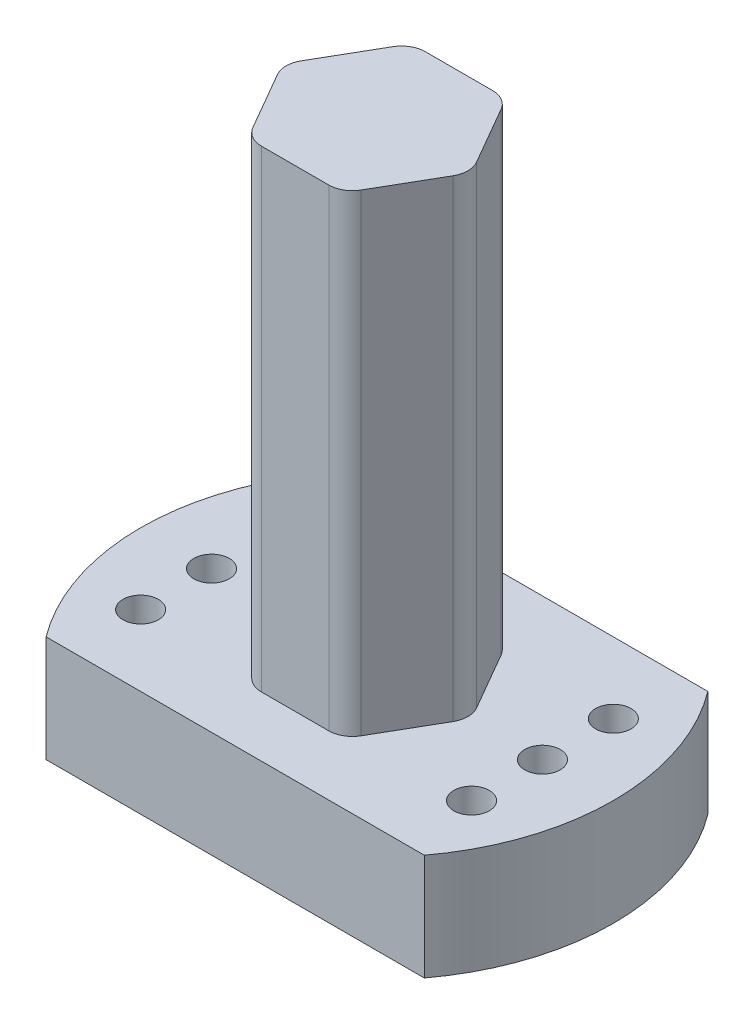
ISO-10303-21;
HEADER;
FILE_DESCRIPTION(('STEP AP214'),'2;1');
FILE_NAME('part.step','',(''),(''),'','','');
FILE_SCHEMA(('AUTOMOTIVE_DESIGN { 1 0 10303 214 1 1 1 1 }'));
ENDSEC;
DATA;
#1=APPLICATION_CONTEXT('core data for automotive mechanical design processes');
#2=APPLICATION_PROTOCOL_DEFINITION('international standard','automotive_design',2000,#1);
#3=PRODUCT_CONTEXT('',#1,'mechanical');
#4=PRODUCT('Part','Part','',(#3));
#5=PRODUCT_RELATED_PRODUCT_CATEGORY('part','',(#4));
#6=PRODUCT_DEFINITION_FORMATION('','',#4);
#7=PRODUCT_DEFINITION_CONTEXT('part definition',#1,'design');
#8=PRODUCT_DEFINITION('design','',#6,#7);
#9=PRODUCT_DEFINITION_SHAPE('','',#8);
#10=(LENGTH_UNIT() NAMED_UNIT(*) SI_UNIT(.MILLI.,.METRE.));
#11=(NAMED_UNIT(*) PLANE_ANGLE_UNIT() SI_UNIT($,.RADIAN.));
#12=(NAMED_UNIT(*) SI_UNIT($,.STERADIAN.) SOLID_ANGLE_UNIT());
#13=UNCERTAINTY_MEASURE_WITH_UNIT(LENGTH_MEASURE(1.E-05),#10,'distance_accuracy_value','');
#14=(GEOMETRIC_REPRESENTATION_CONTEXT(3) GLOBAL_UNCERTAINTY_ASSIGNED_CONTEXT((#13)) GLOBAL_UNIT_ASSIGNED_CONTEXT((#10,
#11,#12)) REPRESENTATION_CONTEXT('',''));
#15=CARTESIAN_POINT('',(0.,0.,0.));
#16=DIRECTION('',(0.,0.,1.));
#17=DIRECTION('',(1.,0.,0.));
#18=AXIS2_PLACEMENT_3D('',#15,#16,#17);
#19=CARTESIAN_POINT('',(0.,4.5,0.));
#20=DIRECTION('',(0.,1.,0.));
#21=DIRECTION('',(0.,0.,1.));
#22=AXIS2_PLACEMENT_3D('',#19,#20,#21);
#23=PLANE('',#22);
#24=CARTESIAN_POINT('',(6.99999999999998,4.5,-3.));
#25=DIRECTION('',(0.,1.,0.));
#26=DIRECTION('',(0.,0.,-1.));
#27=AXIS2_PLACEMENT_3D('',#24,#25,#26);
#28=CIRCLE('',#27,0.750000000000001);
#29=CARTESIAN_POINT('',(6.99999999999998,4.5,-3.75));
#30=VERTEX_POINT('',#29);
#31=EDGE_CURVE('E337',#30,#30,#28,.T.);
#32=ORIENTED_EDGE('',*,*,#31,.F.);
#33=EDGE_LOOP('',(#32));
#34=FACE_BOUND('',#33,.T.);
#35=CARTESIAN_POINT('',(7.,4.5,3.));
#36=DIRECTION('',(0.,1.,0.));
#37=DIRECTION('',(0.,0.,-1.));
#38=AXIS2_PLACEMENT_3D('',#35,#36,#37);
#39=CIRCLE('',#38,0.750000000000001);
#40=CARTESIAN_POINT('',(7.,4.5,2.25));
#41=VERTEX_POINT('',#40);
#42=EDGE_CURVE('E353',#41,#41,#39,.T.);
#43=ORIENTED_EDGE('',*,*,#42,.F.);
#44=EDGE_LOOP('',(#43));
#45=FACE_BOUND('',#44,.T.);
#46=CARTESIAN_POINT('',(-6.99999999999999,4.5,0.));
#47=DIRECTION('',(0.,1.,0.));
#48=DIRECTION('',(0.,0.,1.));
#49=AXIS2_PLACEMENT_3D('',#46,#47,#48);
#50=CIRCLE('',#49,0.749999999999999);
#51=CARTESIAN_POINT('',(-6.99999999999999,4.5,0.750000000000001));
#52=VERTEX_POINT('',#51);
#53=EDGE_CURVE('E369',#52,#52,#50,.T.);
#54=ORIENTED_EDGE('',*,*,#53,.F.);
#55=EDGE_LOOP('',(#54));
#56=FACE_BOUND('',#55,.T.);
#57=CARTESIAN_POINT('',(0.,4.5,0.));
#58=DIRECTION('',(0.,1.,0.));
#59=DIRECTION('',(0.,0.,1.));
#60=AXIS2_PLACEMENT_3D('',#57,#58,#59);
#61=CIRCLE('',#60,10.);
#62=CARTESIAN_POINT('',(-8.,4.5,-6.));
#63=VERTEX_POINT('',#62);
#64=CARTESIAN_POINT('',(-8.,4.5,6.));
#65=VERTEX_POINT('',#64);
#66=EDGE_CURVE('E169',#63,#65,#61,.T.);
#67=ORIENTED_EDGE('',*,*,#66,.T.);
#68=DIRECTION('',(1.,0.,0.));
#69=VECTOR('',#68,1.);
#70=CARTESIAN_POINT('',(8.,4.5,6.));
#71=LINE('',#70,#69);
#72=CARTESIAN_POINT('',(8.,4.5,6.));
#73=VERTEX_POINT('',#72);
#74=EDGE_CURVE('E157',#65,#73,#71,.T.);
#75=ORIENTED_EDGE('',*,*,#74,.T.);
#76=CARTESIAN_POINT('',(0.,4.5,0.));
#77=DIRECTION('',(0.,1.,0.));
#78=DIRECTION('',(0.,0.,1.));
#79=AXIS2_PLACEMENT_3D('',#76,#77,#78);
#80=CIRCLE('',#79,10.);
#81=CARTESIAN_POINT('',(8.,4.5,-6.));
#82=VERTEX_POINT('',#81);
#83=EDGE_CURVE('E168',#73,#82,#80,.T.);
#84=ORIENTED_EDGE('',*,*,#83,.T.);
#85=DIRECTION('',(-1.,0.,0.));
#86=VECTOR('',#85,1.);
#87=CARTESIAN_POINT('',(-8.,4.5,-6.));
#88=LINE('',#87,#86);
#89=EDGE_CURVE('E174',#82,#63,#88,.T.);
#90=ORIENTED_EDGE('',*,*,#89,.T.);
#91=EDGE_LOOP('',(#67,#75,#84,#90));
#92=FACE_BOUND('',#91,.T.);
#93=CARTESIAN_POINT('',(-6.99999999999998,4.5,3.));
#94=DIRECTION('',(0.,1.,0.));
#95=DIRECTION('',(0.,0.,1.));
#96=AXIS2_PLACEMENT_3D('',#93,#94,#95);
#97=CIRCLE('',#96,0.749999999999999);
#98=CARTESIAN_POINT('',(-6.99999999999998,4.5,3.75));
#99=VERTEX_POINT('',#98);
#100=EDGE_CURVE('E361',#99,#99,#97,.T.);
#101=ORIENTED_EDGE('',*,*,#100,.F.);
#102=EDGE_LOOP('',(#101));
#103=FACE_BOUND('',#102,.T.);
#104=CARTESIAN_POINT('',(6.99999999999999,4.5,0.));
#105=DIRECTION('',(0.,1.,0.));
#106=DIRECTION('',(0.,0.,-1.));
#107=AXIS2_PLACEMENT_3D('',#104,#105,#106);
#108=CIRCLE('',#107,0.750000000000001);
#109=CARTESIAN_POINT('',(6.99999999999999,4.5,-0.75));
#110=VERTEX_POINT('',#109);
#111=EDGE_CURVE('E345',#110,#110,#108,.T.);
#112=ORIENTED_EDGE('',*,*,#111,.F.);
#113=EDGE_LOOP('',(#112));
#114=FACE_BOUND('',#113,.T.);
#115=CARTESIAN_POINT('',(-7.,4.5,-3.));
#116=DIRECTION('',(0.,1.,0.));
#117=DIRECTION('',(0.,0.,1.));
#118=AXIS2_PLACEMENT_3D('',#115,#116,#117);
#119=CIRCLE('',#118,0.749999999999999);
#120=CARTESIAN_POINT('',(-7.,4.5,-2.25));
#121=VERTEX_POINT('',#120);
#122=EDGE_CURVE('E329',#121,#121,#119,.T.);
#123=ORIENTED_EDGE('',*,*,#122,.F.);
#124=EDGE_LOOP('',(#123));
#125=FACE_BOUND('',#124,.T.);
#126=DIRECTION('',(-1.,0.,0.));
#127=VECTOR('',#126,1.);
#128=CARTESIAN_POINT('',(2.,4.5,-3.46410161513776));
#129=LINE('',#128,#127);
#130=CARTESIAN_POINT('',(1.42264973081037,4.5,-3.46410161513776));
#131=VERTEX_POINT('',#130);
#132=CARTESIAN_POINT('',(-1.42264973081037,4.5,-3.46410161513775));
#133=VERTEX_POINT('',#132);
#134=EDGE_CURVE('E315',#131,#133,#129,.T.);
#135=ORIENTED_EDGE('',*,*,#134,.F.);
#136=CARTESIAN_POINT('',(1.42264973081037,4.5,-2.46410161513776));
#137=DIRECTION('',(0.,1.,0.));
#138=DIRECTION('',(0.,0.,1.));
#139=AXIS2_PLACEMENT_3D('',#136,#137,#138);
#140=CIRCLE('',#139,1.);
#141=CARTESIAN_POINT('',(2.28867513459481,4.5,-2.96410161513776));
#142=VERTEX_POINT('',#141);
#143=EDGE_CURVE('E256',#131,#142,#140,.F.);
#144=ORIENTED_EDGE('',*,*,#143,.T.);
#145=DIRECTION('',(-0.5,0.,-0.866025403784439));
#146=VECTOR('',#145,1.);
#147=CARTESIAN_POINT('',(4.,4.5,0.));
#148=LINE('',#147,#146);
#149=CARTESIAN_POINT('',(3.71132486540519,4.5,-0.500000000000001));
#150=VERTEX_POINT('',#149);
#151=EDGE_CURVE('E267',#150,#142,#148,.T.);
#152=ORIENTED_EDGE('',*,*,#151,.F.);
#153=CARTESIAN_POINT('',(2.84529946162075,4.5,0.));
#154=DIRECTION('',(0.,1.,0.));
#155=DIRECTION('',(0.,0.,1.));
#156=AXIS2_PLACEMENT_3D('',#153,#154,#155);
#157=CIRCLE('',#156,1.);
#158=CARTESIAN_POINT('',(3.71132486540519,4.5,0.499999999999999));
#159=VERTEX_POINT('',#158);
#160=EDGE_CURVE('E259',#150,#159,#157,.F.);
#161=ORIENTED_EDGE('',*,*,#160,.T.);
#162=DIRECTION('',(0.5,0.,-0.866025403784439));
#163=VECTOR('',#162,1.);
#164=CARTESIAN_POINT('',(2.,4.5,3.46410161513775));
#165=LINE('',#164,#163);
#166=CARTESIAN_POINT('',(2.28867513459481,4.5,2.96410161513775));
#167=VERTEX_POINT('',#166);
#168=EDGE_CURVE('E265',#167,#159,#165,.T.);
#169=ORIENTED_EDGE('',*,*,#168,.F.);
#170=CARTESIAN_POINT('',(1.42264973081037,4.5,2.46410161513775));
#171=DIRECTION('',(0.,1.,0.));
#172=DIRECTION('',(0.,0.,1.));
#173=AXIS2_PLACEMENT_3D('',#170,#171,#172);
#174=CIRCLE('',#173,1.);
#175=CARTESIAN_POINT('',(1.42264973081037,4.5,3.46410161513775));
#176=VERTEX_POINT('',#175);
#177=EDGE_CURVE('E53',#167,#176,#174,.F.);
#178=ORIENTED_EDGE('',*,*,#177,.T.);
#179=DIRECTION('',(1.,0.,0.));
#180=VECTOR('',#179,1.);
#181=CARTESIAN_POINT('',(-2.,4.5,3.46410161513775));
#182=LINE('',#181,#180);
#183=CARTESIAN_POINT('',(-1.42264973081037,4.5,3.46410161513775));
#184=VERTEX_POINT('',#183);
#185=EDGE_CURVE('E278',#184,#176,#182,.T.);
#186=ORIENTED_EDGE('',*,*,#185,.F.);
#187=CARTESIAN_POINT('',(-1.42264973081037,4.5,2.46410161513775));
#188=DIRECTION('',(0.,1.,0.));
#189=DIRECTION('',(0.,0.,1.));
#190=AXIS2_PLACEMENT_3D('',#187,#188,#189);
#191=CIRCLE('',#190,1.);
#192=CARTESIAN_POINT('',(-2.28867513459481,4.5,2.96410161513776));
#193=VERTEX_POINT('',#192);
#194=EDGE_CURVE('E11',#184,#193,#191,.F.);
#195=ORIENTED_EDGE('',*,*,#194,.T.);
#196=DIRECTION('',(0.5,0.,0.866025403784439));
#197=VECTOR('',#196,1.);
#198=CARTESIAN_POINT('',(-4.,4.5,0.));
#199=LINE('',#198,#197);
#200=CARTESIAN_POINT('',(-3.71132486540519,4.5,0.499999999999999));
#201=VERTEX_POINT('',#200);
#202=EDGE_CURVE('E323',#201,#193,#199,.T.);
#203=ORIENTED_EDGE('',*,*,#202,.F.);
#204=CARTESIAN_POINT('',(-2.84529946162075,4.5,0.));
#205=DIRECTION('',(0.,1.,0.));
#206=DIRECTION('',(0.,0.,1.));
#207=AXIS2_PLACEMENT_3D('',#204,#205,#206);
#208=CIRCLE('',#207,1.);
#209=CARTESIAN_POINT('',(-3.71132486540519,4.5,-0.5));
#210=VERTEX_POINT('',#209);
#211=EDGE_CURVE('E250',#201,#210,#208,.F.);
#212=ORIENTED_EDGE('',*,*,#211,.T.);
#213=DIRECTION('',(-0.5,0.,0.866025403784439));
#214=VECTOR('',#213,1.);
#215=CARTESIAN_POINT('',(-2.,4.5,-3.46410161513775));
#216=LINE('',#215,#214);
#217=CARTESIAN_POINT('',(-2.28867513459481,4.5,-2.96410161513775));
#218=VERTEX_POINT('',#217);
#219=EDGE_CURVE('E319',#218,#210,#216,.T.);
#220=ORIENTED_EDGE('',*,*,#219,.F.);
#221=CARTESIAN_POINT('',(-1.42264973081037,4.5,-2.46410161513775));
#222=DIRECTION('',(0.,1.,0.));
#223=DIRECTION('',(0.,0.,1.));
#224=AXIS2_PLACEMENT_3D('',#221,#222,#223);
#225=CIRCLE('',#224,1.);
#226=EDGE_CURVE('E253',#218,#133,#225,.F.);
#227=ORIENTED_EDGE('',*,*,#226,.T.);
#228=EDGE_LOOP('',(#135,#144,#152,#161,#169,#178,#186,#195,#203,#212,#220,#227));
#229=FACE_BOUND('',#228,.T.);
#230=ADVANCED_FACE('F44',(#34,#45,#56,#92,#103,#114,#125,#229),#23,.T.);
#231=CARTESIAN_POINT('',(0.,0.,0.));
#232=DIRECTION('',(0.,1.,0.));
#233=DIRECTION('',(0.,0.,1.));
#234=AXIS2_PLACEMENT_3D('',#231,#232,#233);
#235=PLANE('',#234);
#236=CARTESIAN_POINT('',(0.,0.,0.));
#237=DIRECTION('',(0.,1.,0.));
#238=DIRECTION('',(0.,0.,1.));
#239=AXIS2_PLACEMENT_3D('',#236,#237,#238);
#240=CIRCLE('',#239,10.);
#241=CARTESIAN_POINT('',(-8.,0.,-6.));
#242=VERTEX_POINT('',#241);
#243=CARTESIAN_POINT('',(-8.,0.,6.));
#244=VERTEX_POINT('',#243);
#245=EDGE_CURVE('E183',#242,#244,#240,.T.);
#246=ORIENTED_EDGE('',*,*,#245,.F.);
#247=DIRECTION('',(-1.,0.,0.));
#248=VECTOR('',#247,1.);
#249=CARTESIAN_POINT('',(-8.,0.,-6.));
#250=LINE('',#249,#248);
#251=CARTESIAN_POINT('',(8.,0.,-6.));
#252=VERTEX_POINT('',#251);
#253=EDGE_CURVE('E179',#252,#242,#250,.T.);
#254=ORIENTED_EDGE('',*,*,#253,.F.);
#255=CARTESIAN_POINT('',(0.,0.,0.));
#256=DIRECTION('',(0.,1.,0.));
#257=DIRECTION('',(0.,0.,1.));
#258=AXIS2_PLACEMENT_3D('',#255,#256,#257);
#259=CIRCLE('',#258,10.);
#260=CARTESIAN_POINT('',(8.,0.,6.));
#261=VERTEX_POINT('',#260);
#262=EDGE_CURVE('E386',#261,#252,#259,.T.);
#263=ORIENTED_EDGE('',*,*,#262,.F.);
#264=DIRECTION('',(1.,0.,0.));
#265=VECTOR('',#264,1.);
#266=CARTESIAN_POINT('',(8.,0.,6.));
#267=LINE('',#266,#265);
#268=EDGE_CURVE('E383',#244,#261,#267,.T.);
#269=ORIENTED_EDGE('',*,*,#268,.F.);
#270=EDGE_LOOP('',(#246,#254,#263,#269));
#271=FACE_BOUND('',#270,.T.);
#272=CARTESIAN_POINT('',(-6.99999999999999,0.,0.));
#273=DIRECTION('',(0.,1.,0.));
#274=DIRECTION('',(0.,0.,1.));
#275=AXIS2_PLACEMENT_3D('',#272,#273,#274);
#276=CIRCLE('',#275,0.749999999999999);
#277=CARTESIAN_POINT('',(-6.99999999999999,0.,0.750000000000001));
#278=VERTEX_POINT('',#277);
#279=EDGE_CURVE('E365',#278,#278,#276,.T.);
#280=ORIENTED_EDGE('',*,*,#279,.T.);
#281=EDGE_LOOP('',(#280));
#282=FACE_BOUND('',#281,.T.);
#283=CARTESIAN_POINT('',(-6.99999999999998,0.,3.));
#284=DIRECTION('',(0.,1.,0.));
#285=DIRECTION('',(0.,0.,1.));
#286=AXIS2_PLACEMENT_3D('',#283,#284,#285);
#287=CIRCLE('',#286,0.749999999999999);
#288=CARTESIAN_POINT('',(-6.99999999999998,0.,3.75));
#289=VERTEX_POINT('',#288);
#290=EDGE_CURVE('E357',#289,#289,#287,.T.);
#291=ORIENTED_EDGE('',*,*,#290,.T.);
#292=EDGE_LOOP('',(#291));
#293=FACE_BOUND('',#292,.T.);
#294=CARTESIAN_POINT('',(7.,0.,3.));
#295=DIRECTION('',(0.,1.,0.));
#296=DIRECTION('',(0.,0.,-1.));
#297=AXIS2_PLACEMENT_3D('',#294,#295,#296);
#298=CIRCLE('',#297,0.750000000000001);
#299=CARTESIAN_POINT('',(7.,0.,2.25));
#300=VERTEX_POINT('',#299);
#301=EDGE_CURVE('E349',#300,#300,#298,.T.);
#302=ORIENTED_EDGE('',*,*,#301,.T.);
#303=EDGE_LOOP('',(#302));
#304=FACE_BOUND('',#303,.T.);
#305=CARTESIAN_POINT('',(6.99999999999999,0.,0.));
#306=DIRECTION('',(0.,1.,0.));
#307=DIRECTION('',(0.,0.,-1.));
#308=AXIS2_PLACEMENT_3D('',#305,#306,#307);
#309=CIRCLE('',#308,0.750000000000001);
#310=CARTESIAN_POINT('',(6.99999999999999,0.,-0.75));
#311=VERTEX_POINT('',#310);
#312=EDGE_CURVE('E341',#311,#311,#309,.T.);
#313=ORIENTED_EDGE('',*,*,#312,.T.);
#314=EDGE_LOOP('',(#313));
#315=FACE_BOUND('',#314,.T.);
#316=CARTESIAN_POINT('',(6.99999999999998,0.,-3.));
#317=DIRECTION('',(0.,1.,0.));
#318=DIRECTION('',(0.,0.,-1.));
#319=AXIS2_PLACEMENT_3D('',#316,#317,#318);
#320=CIRCLE('',#319,0.750000000000001);
#321=CARTESIAN_POINT('',(6.99999999999998,0.,-3.75));
#322=VERTEX_POINT('',#321);
#323=EDGE_CURVE('E333',#322,#322,#320,.T.);
#324=ORIENTED_EDGE('',*,*,#323,.T.);
#325=EDGE_LOOP('',(#324));
#326=FACE_BOUND('',#325,.T.);
#327=CARTESIAN_POINT('',(-7.,0.,-3.));
#328=DIRECTION('',(0.,1.,0.));
#329=DIRECTION('',(0.,0.,1.));
#330=AXIS2_PLACEMENT_3D('',#327,#328,#329);
#331=CIRCLE('',#330,0.749999999999999);
#332=CARTESIAN_POINT('',(-7.,0.,-2.25));
#333=VERTEX_POINT('',#332);
#334=EDGE_CURVE('E312',#333,#333,#331,.T.);
#335=ORIENTED_EDGE('',*,*,#334,.T.);
#336=EDGE_LOOP('',(#335));
#337=FACE_BOUND('',#336,.T.);
#338=ADVANCED_FACE('F401',(#271,#282,#293,#304,#315,#326,#337),#235,.F.);
#339=CARTESIAN_POINT('',(0.,4.5,0.));
#340=DIRECTION('',(0.,-1.,0.));
#341=DIRECTION('',(0.,0.,-1.));
#342=AXIS2_PLACEMENT_3D('',#339,#340,#341);
#343=CYLINDRICAL_SURFACE('',#342,10.);
#344=ORIENTED_EDGE('',*,*,#245,.T.);
#345=DIRECTION('',(0.,-1.,0.));
#346=VECTOR('',#345,1.);
#347=CARTESIAN_POINT('',(-8.,4.5,6.));
#348=LINE('',#347,#346);
#349=EDGE_CURVE('E161',#65,#244,#348,.T.);
#350=ORIENTED_EDGE('',*,*,#349,.F.);
#351=ORIENTED_EDGE('',*,*,#66,.F.);
#352=DIRECTION('',(0.,-1.,0.));
#353=VECTOR('',#352,1.);
#354=CARTESIAN_POINT('',(-8.,4.5,-6.));
#355=LINE('',#354,#353);
#356=EDGE_CURVE('E380',#63,#242,#355,.T.);
#357=ORIENTED_EDGE('',*,*,#356,.T.);
#358=EDGE_LOOP('',(#344,#350,#351,#357));
#359=FACE_BOUND('',#358,.T.);
#360=ADVANCED_FACE('F181',(#359),#343,.T.);
#361=CARTESIAN_POINT('',(8.,4.5,6.));
#362=DIRECTION('',(0.,0.,-1.));
#363=DIRECTION('',(-1.,0.,0.));
#364=AXIS2_PLACEMENT_3D('',#361,#362,#363);
#365=PLANE('',#364);
#366=ORIENTED_EDGE('',*,*,#268,.T.);
#367=DIRECTION('',(0.,-1.,0.));
#368=VECTOR('',#367,1.);
#369=CARTESIAN_POINT('',(8.,4.5,6.));
#370=LINE('',#369,#368);
#371=EDGE_CURVE('E164',#73,#261,#370,.T.);
#372=ORIENTED_EDGE('',*,*,#371,.F.);
#373=ORIENTED_EDGE('',*,*,#74,.F.);
#374=ORIENTED_EDGE('',*,*,#349,.T.);
#375=EDGE_LOOP('',(#366,#372,#373,#374));
#376=FACE_BOUND('',#375,.T.);
#377=ADVANCED_FACE('F159',(#376),#365,.F.);
#378=CARTESIAN_POINT('',(0.,4.5,0.));
#379=DIRECTION('',(0.,-1.,0.));
#380=DIRECTION('',(0.,0.,-1.));
#381=AXIS2_PLACEMENT_3D('',#378,#379,#380);
#382=CYLINDRICAL_SURFACE('',#381,10.);
#383=ORIENTED_EDGE('',*,*,#262,.T.);
#384=DIRECTION('',(0.,-1.,0.));
#385=VECTOR('',#384,1.);
#386=CARTESIAN_POINT('',(8.,4.5,-6.));
#387=LINE('',#386,#385);
#388=EDGE_CURVE('E191',#82,#252,#387,.T.);
#389=ORIENTED_EDGE('',*,*,#388,.F.);
#390=ORIENTED_EDGE('',*,*,#83,.F.);
#391=ORIENTED_EDGE('',*,*,#371,.T.);
#392=EDGE_LOOP('',(#383,#389,#390,#391));
#393=FACE_BOUND('',#392,.T.);
#394=ADVANCED_FACE('F403',(#393),#382,.T.);
#395=CARTESIAN_POINT('',(-8.,4.5,-6.));
#396=DIRECTION('',(0.,0.,1.));
#397=DIRECTION('',(1.,0.,0.));
#398=AXIS2_PLACEMENT_3D('',#395,#396,#397);
#399=PLANE('',#398);
#400=ORIENTED_EDGE('',*,*,#253,.T.);
#401=ORIENTED_EDGE('',*,*,#356,.F.);
#402=ORIENTED_EDGE('',*,*,#89,.F.);
#403=ORIENTED_EDGE('',*,*,#388,.T.);
#404=EDGE_LOOP('',(#400,#401,#402,#403));
#405=FACE_BOUND('',#404,.T.);
#406=ADVANCED_FACE('F397',(#405),#399,.F.);
#407=CARTESIAN_POINT('',(-6.99999999999999,4.5,0.));
#408=DIRECTION('',(0.,-1.,0.));
#409=DIRECTION('',(0.,0.,-1.));
#410=AXIS2_PLACEMENT_3D('',#407,#408,#409);
#411=CYLINDRICAL_SURFACE('',#410,0.749999999999999);
#412=ORIENTED_EDGE('',*,*,#53,.T.);
#413=EDGE_LOOP('',(#412));
#414=FACE_BOUND('',#413,.T.);
#415=ORIENTED_EDGE('',*,*,#279,.F.);
#416=EDGE_LOOP('',(#415));
#417=FACE_BOUND('',#416,.T.);
#418=ADVANCED_FACE('F410',(#414,#417),#411,.F.);
#419=CARTESIAN_POINT('',(-6.99999999999998,4.5,3.));
#420=DIRECTION('',(0.,-1.,0.));
#421=DIRECTION('',(0.,0.,-1.));
#422=AXIS2_PLACEMENT_3D('',#419,#420,#421);
#423=CYLINDRICAL_SURFACE('',#422,0.749999999999999);
#424=ORIENTED_EDGE('',*,*,#100,.T.);
#425=EDGE_LOOP('',(#424));
#426=FACE_BOUND('',#425,.T.);
#427=ORIENTED_EDGE('',*,*,#290,.F.);
#428=EDGE_LOOP('',(#427));
#429=FACE_BOUND('',#428,.T.);
#430=ADVANCED_FACE('F427',(#426,#429),#423,.F.);
#431=CARTESIAN_POINT('',(7.,4.5,3.));
#432=DIRECTION('',(0.,-1.,0.));
#433=DIRECTION('',(0.,0.,-1.));
#434=AXIS2_PLACEMENT_3D('',#431,#432,#433);
#435=CYLINDRICAL_SURFACE('',#434,0.750000000000001);
#436=ORIENTED_EDGE('',*,*,#42,.T.);
#437=EDGE_LOOP('',(#436));
#438=FACE_BOUND('',#437,.T.);
#439=ORIENTED_EDGE('',*,*,#301,.F.);
#440=EDGE_LOOP('',(#439));
#441=FACE_BOUND('',#440,.T.);
#442=ADVANCED_FACE('F431',(#438,#441),#435,.F.);
#443=CARTESIAN_POINT('',(6.99999999999999,4.5,0.));
#444=DIRECTION('',(0.,-1.,0.));
#445=DIRECTION('',(0.,0.,-1.));
#446=AXIS2_PLACEMENT_3D('',#443,#444,#445);
#447=CYLINDRICAL_SURFACE('',#446,0.750000000000001);
#448=ORIENTED_EDGE('',*,*,#111,.T.);
#449=EDGE_LOOP('',(#448));
#450=FACE_BOUND('',#449,.T.);
#451=ORIENTED_EDGE('',*,*,#312,.F.);
#452=EDGE_LOOP('',(#451));
#453=FACE_BOUND('',#452,.T.);
#454=ADVANCED_FACE('F435',(#450,#453),#447,.F.);
#455=CARTESIAN_POINT('',(6.99999999999998,4.5,-3.));
#456=DIRECTION('',(0.,-1.,0.));
#457=DIRECTION('',(0.,0.,-1.));
#458=AXIS2_PLACEMENT_3D('',#455,#456,#457);
#459=CYLINDRICAL_SURFACE('',#458,0.750000000000001);
#460=ORIENTED_EDGE('',*,*,#31,.T.);
#461=EDGE_LOOP('',(#460));
#462=FACE_BOUND('',#461,.T.);
#463=ORIENTED_EDGE('',*,*,#323,.F.);
#464=EDGE_LOOP('',(#463));
#465=FACE_BOUND('',#464,.T.);
#466=ADVANCED_FACE('F439',(#462,#465),#459,.F.);
#467=CARTESIAN_POINT('',(-7.,4.5,-3.));
#468=DIRECTION('',(0.,-1.,0.));
#469=DIRECTION('',(0.,0.,-1.));
#470=AXIS2_PLACEMENT_3D('',#467,#468,#469);
#471=CYLINDRICAL_SURFACE('',#470,0.749999999999999);
#472=ORIENTED_EDGE('',*,*,#122,.T.);
#473=EDGE_LOOP('',(#472));
#474=FACE_BOUND('',#473,.T.);
#475=ORIENTED_EDGE('',*,*,#334,.F.);
#476=EDGE_LOOP('',(#475));
#477=FACE_BOUND('',#476,.T.);
#478=ADVANCED_FACE('F443',(#474,#477),#471,.F.);
#479=CARTESIAN_POINT('',(4.,24.5,0.));
#480=DIRECTION('',(-0.866025403784438,0.,0.5));
#481=DIRECTION('',(0.5,0.,0.866025403784439));
#482=AXIS2_PLACEMENT_3D('',#479,#480,#481);
#483=PLANE('',#482);
#484=ORIENTED_EDGE('',*,*,#151,.T.);
#485=DIRECTION('',(0.,-1.,0.));
#486=VECTOR('',#485,1.);
#487=CARTESIAN_POINT('',(2.28867513459481,24.5,-2.96410161513776));
#488=LINE('',#487,#486);
#489=CARTESIAN_POINT('',(2.28867513459481,24.5,-2.96410161513776));
#490=VERTEX_POINT('',#489);
#491=EDGE_CURVE('E234',#142,#490,#488,.F.);
#492=ORIENTED_EDGE('',*,*,#491,.T.);
#493=DIRECTION('',(-0.5,0.,-0.866025403784439));
#494=VECTOR('',#493,1.);
#495=CARTESIAN_POINT('',(4.,24.5,0.));
#496=LINE('',#495,#494);
#497=CARTESIAN_POINT('',(3.71132486540519,24.5,-0.500000000000001));
#498=VERTEX_POINT('',#497);
#499=EDGE_CURVE('E277',#498,#490,#496,.T.);
#500=ORIENTED_EDGE('',*,*,#499,.F.);
#501=DIRECTION('',(0.,-1.,0.));
#502=VECTOR('',#501,1.);
#503=CARTESIAN_POINT('',(3.71132486540519,24.5,-0.500000000000001));
#504=LINE('',#503,#502);
#505=EDGE_CURVE('E230',#498,#150,#504,.T.);
#506=ORIENTED_EDGE('',*,*,#505,.T.);
#507=EDGE_LOOP('',(#484,#492,#500,#506));
#508=FACE_BOUND('',#507,.T.);
#509=ADVANCED_FACE('F290',(#508),#483,.F.);
#510=CARTESIAN_POINT('',(2.,24.5,-3.46410161513776));
#511=DIRECTION('',(0.,0.,1.));
#512=DIRECTION('',(1.,0.,0.));
#513=AXIS2_PLACEMENT_3D('',#510,#511,#512);
#514=PLANE('',#513);
#515=ORIENTED_EDGE('',*,*,#134,.T.);
#516=DIRECTION('',(0.,-1.,0.));
#517=VECTOR('',#516,1.);
#518=CARTESIAN_POINT('',(-1.42264973081037,24.5,-3.46410161513775));
#519=LINE('',#518,#517);
#520=CARTESIAN_POINT('',(-1.42264973081037,24.5,-3.46410161513775));
#521=VERTEX_POINT('',#520);
#522=EDGE_CURVE('E227',#133,#521,#519,.F.);
#523=ORIENTED_EDGE('',*,*,#522,.T.);
#524=DIRECTION('',(-1.,0.,0.));
#525=VECTOR('',#524,1.);
#526=CARTESIAN_POINT('',(2.,24.5,-3.46410161513776));
#527=LINE('',#526,#525);
#528=CARTESIAN_POINT('',(1.42264973081037,24.5,-3.46410161513776));
#529=VERTEX_POINT('',#528);
#530=EDGE_CURVE('E293',#529,#521,#527,.T.);
#531=ORIENTED_EDGE('',*,*,#530,.F.);
#532=DIRECTION('',(0.,-1.,0.));
#533=VECTOR('',#532,1.);
#534=CARTESIAN_POINT('',(1.42264973081037,24.5,-3.46410161513776));
#535=LINE('',#534,#533);
#536=EDGE_CURVE('E223',#529,#131,#535,.T.);
#537=ORIENTED_EDGE('',*,*,#536,.T.);
#538=EDGE_LOOP('',(#515,#523,#531,#537));
#539=FACE_BOUND('',#538,.T.);
#540=ADVANCED_FACE('F448',(#539),#514,.F.);
#541=CARTESIAN_POINT('',(-2.,24.5,-3.46410161513775));
#542=DIRECTION('',(0.866025403784439,0.,0.5));
#543=DIRECTION('',(0.5,0.,-0.866025403784439));
#544=AXIS2_PLACEMENT_3D('',#541,#542,#543);
#545=PLANE('',#544);
#546=ORIENTED_EDGE('',*,*,#219,.T.);
#547=DIRECTION('',(0.,-1.,0.));
#548=VECTOR('',#547,1.);
#549=CARTESIAN_POINT('',(-3.71132486540519,24.5,-0.5));
#550=LINE('',#549,#548);
#551=CARTESIAN_POINT('',(-3.71132486540519,24.5,-0.5));
#552=VERTEX_POINT('',#551);
#553=EDGE_CURVE('E202',#210,#552,#550,.F.);
#554=ORIENTED_EDGE('',*,*,#553,.T.);
#555=DIRECTION('',(-0.5,0.,0.866025403784439));
#556=VECTOR('',#555,1.);
#557=CARTESIAN_POINT('',(-2.,24.5,-3.46410161513775));
#558=LINE('',#557,#556);
#559=CARTESIAN_POINT('',(-2.28867513459481,24.5,-2.96410161513775));
#560=VERTEX_POINT('',#559);
#561=EDGE_CURVE('E297',#560,#552,#558,.T.);
#562=ORIENTED_EDGE('',*,*,#561,.F.);
#563=DIRECTION('',(0.,-1.,0.));
#564=VECTOR('',#563,1.);
#565=CARTESIAN_POINT('',(-2.28867513459481,24.5,-2.96410161513775));
#566=LINE('',#565,#564);
#567=EDGE_CURVE('E198',#560,#218,#566,.T.);
#568=ORIENTED_EDGE('',*,*,#567,.T.);
#569=EDGE_LOOP('',(#546,#554,#562,#568));
#570=FACE_BOUND('',#569,.T.);
#571=ADVANCED_FACE('F451',(#570),#545,.F.);
#572=CARTESIAN_POINT('',(-4.,24.5,0.));
#573=DIRECTION('',(0.866025403784439,0.,-0.5));
#574=DIRECTION('',(-0.5,0.,-0.866025403784439));
#575=AXIS2_PLACEMENT_3D('',#572,#573,#574);
#576=PLANE('',#575);
#577=DIRECTION('',(0.5,0.,0.866025403784439));
#578=VECTOR('',#577,1.);
#579=CARTESIAN_POINT('',(-4.,24.5,0.));
#580=LINE('',#579,#578);
#581=CARTESIAN_POINT('',(-3.71132486540519,24.5,0.499999999999999));
#582=VERTEX_POINT('',#581);
#583=CARTESIAN_POINT('',(-2.28867513459481,24.5,2.96410161513776));
#584=VERTEX_POINT('',#583);
#585=EDGE_CURVE('E302',#582,#584,#580,.T.);
#586=ORIENTED_EDGE('',*,*,#585,.F.);
#587=DIRECTION('',(0.,-1.,0.));
#588=VECTOR('',#587,1.);
#589=CARTESIAN_POINT('',(-3.71132486540519,24.5,0.499999999999999));
#590=LINE('',#589,#588);
#591=EDGE_CURVE('E189',#582,#201,#590,.T.);
#592=ORIENTED_EDGE('',*,*,#591,.T.);
#593=ORIENTED_EDGE('',*,*,#202,.T.);
#594=DIRECTION('',(0.,-1.,0.));
#595=VECTOR('',#594,1.);
#596=CARTESIAN_POINT('',(-2.28867513459481,24.5,2.96410161513776));
#597=LINE('',#596,#595);
#598=EDGE_CURVE('E185',#193,#584,#597,.F.);
#599=ORIENTED_EDGE('',*,*,#598,.T.);
#600=EDGE_LOOP('',(#586,#592,#593,#599));
#601=FACE_BOUND('',#600,.T.);
#602=ADVANCED_FACE('F455',(#601),#576,.F.);
#603=CARTESIAN_POINT('',(-2.,24.5,3.46410161513775));
#604=DIRECTION('',(0.,0.,-1.));
#605=DIRECTION('',(-1.,0.,0.));
#606=AXIS2_PLACEMENT_3D('',#603,#604,#605);
#607=PLANE('',#606);
#608=ORIENTED_EDGE('',*,*,#185,.T.);
#609=DIRECTION('',(0.,-1.,0.));
#610=VECTOR('',#609,1.);
#611=CARTESIAN_POINT('',(1.42264973081037,24.5,3.46410161513775));
#612=LINE('',#611,#610);
#613=CARTESIAN_POINT('',(1.42264973081037,24.5,3.46410161513775));
#614=VERTEX_POINT('',#613);
#615=EDGE_CURVE('E247',#176,#614,#612,.F.);
#616=ORIENTED_EDGE('',*,*,#615,.T.);
#617=DIRECTION('',(1.,0.,0.));
#618=VECTOR('',#617,1.);
#619=CARTESIAN_POINT('',(-2.,24.5,3.46410161513775));
#620=LINE('',#619,#618);
#621=CARTESIAN_POINT('',(-1.42264973081037,24.5,3.46410161513775));
#622=VERTEX_POINT('',#621);
#623=EDGE_CURVE('E306',#622,#614,#620,.T.);
#624=ORIENTED_EDGE('',*,*,#623,.F.);
#625=DIRECTION('',(0.,-1.,0.));
#626=VECTOR('',#625,1.);
#627=CARTESIAN_POINT('',(-1.42264973081037,24.5,3.46410161513775));
#628=LINE('',#627,#626);
#629=EDGE_CURVE('E244',#622,#184,#628,.T.);
#630=ORIENTED_EDGE('',*,*,#629,.T.);
#631=EDGE_LOOP('',(#608,#616,#624,#630));
#632=FACE_BOUND('',#631,.T.);
#633=ADVANCED_FACE('F459',(#632),#607,.F.);
#634=CARTESIAN_POINT('',(2.,24.5,3.46410161513775));
#635=DIRECTION('',(-0.866025403784439,0.,-0.5));
#636=DIRECTION('',(-0.5,0.,0.866025403784439));
#637=AXIS2_PLACEMENT_3D('',#634,#635,#636);
#638=PLANE('',#637);
#639=ORIENTED_EDGE('',*,*,#168,.T.);
#640=DIRECTION('',(0.,-1.,0.));
#641=VECTOR('',#640,1.);
#642=CARTESIAN_POINT('',(3.71132486540519,24.5,0.499999999999999));
#643=LINE('',#642,#641);
#644=CARTESIAN_POINT('',(3.71132486540519,24.5,0.499999999999999));
#645=VERTEX_POINT('',#644);
#646=EDGE_CURVE('E241',#159,#645,#643,.F.);
#647=ORIENTED_EDGE('',*,*,#646,.T.);
#648=DIRECTION('',(0.5,0.,-0.866025403784439));
#649=VECTOR('',#648,1.);
#650=CARTESIAN_POINT('',(2.,24.5,3.46410161513775));
#651=LINE('',#650,#649);
#652=CARTESIAN_POINT('',(2.28867513459481,24.5,2.96410161513775));
#653=VERTEX_POINT('',#652);
#654=EDGE_CURVE('E288',#653,#645,#651,.T.);
#655=ORIENTED_EDGE('',*,*,#654,.F.);
#656=DIRECTION('',(0.,-1.,0.));
#657=VECTOR('',#656,1.);
#658=CARTESIAN_POINT('',(2.28867513459481,24.5,2.96410161513775));
#659=LINE('',#658,#657);
#660=EDGE_CURVE('E237',#653,#167,#659,.T.);
#661=ORIENTED_EDGE('',*,*,#660,.T.);
#662=EDGE_LOOP('',(#639,#647,#655,#661));
#663=FACE_BOUND('',#662,.T.);
#664=ADVANCED_FACE('F272',(#663),#638,.F.);
#665=CARTESIAN_POINT('',(0.,24.5,0.));
#666=DIRECTION('',(0.,1.,0.));
#667=DIRECTION('',(0.,0.,1.));
#668=AXIS2_PLACEMENT_3D('',#665,#666,#667);
#669=PLANE('',#668);
#670=ORIENTED_EDGE('',*,*,#561,.T.);
#671=CARTESIAN_POINT('',(-2.84529946162075,24.5,0.));
#672=DIRECTION('',(0.,1.,0.));
#673=DIRECTION('',(0.,0.,1.));
#674=AXIS2_PLACEMENT_3D('',#671,#672,#673);
#675=CIRCLE('',#674,1.);
#676=EDGE_CURVE('E220',#552,#582,#675,.T.);
#677=ORIENTED_EDGE('',*,*,#676,.T.);
#678=ORIENTED_EDGE('',*,*,#585,.T.);
#679=CARTESIAN_POINT('',(-1.42264973081037,24.5,2.46410161513775));
#680=DIRECTION('',(0.,1.,0.));
#681=DIRECTION('',(0.,0.,1.));
#682=AXIS2_PLACEMENT_3D('',#679,#680,#681);
#683=CIRCLE('',#682,1.);
#684=EDGE_CURVE('E205',#584,#622,#683,.T.);
#685=ORIENTED_EDGE('',*,*,#684,.T.);
#686=ORIENTED_EDGE('',*,*,#623,.T.);
#687=CARTESIAN_POINT('',(1.42264973081037,24.5,2.46410161513775));
#688=DIRECTION('',(0.,1.,0.));
#689=DIRECTION('',(0.,0.,1.));
#690=AXIS2_PLACEMENT_3D('',#687,#688,#689);
#691=CIRCLE('',#690,1.);
#692=EDGE_CURVE('E208',#614,#653,#691,.T.);
#693=ORIENTED_EDGE('',*,*,#692,.T.);
#694=ORIENTED_EDGE('',*,*,#654,.T.);
#695=CARTESIAN_POINT('',(2.84529946162075,24.5,0.));
#696=DIRECTION('',(0.,1.,0.));
#697=DIRECTION('',(0.,0.,1.));
#698=AXIS2_PLACEMENT_3D('',#695,#696,#697);
#699=CIRCLE('',#698,1.);
#700=EDGE_CURVE('E211',#645,#498,#699,.T.);
#701=ORIENTED_EDGE('',*,*,#700,.T.);
#702=ORIENTED_EDGE('',*,*,#499,.T.);
#703=CARTESIAN_POINT('',(1.42264973081037,24.5,-2.46410161513776));
#704=DIRECTION('',(0.,1.,0.));
#705=DIRECTION('',(0.,0.,1.));
#706=AXIS2_PLACEMENT_3D('',#703,#704,#705);
#707=CIRCLE('',#706,1.);
#708=EDGE_CURVE('E214',#490,#529,#707,.T.);
#709=ORIENTED_EDGE('',*,*,#708,.T.);
#710=ORIENTED_EDGE('',*,*,#530,.T.);
#711=CARTESIAN_POINT('',(-1.42264973081037,24.5,-2.46410161513775));
#712=DIRECTION('',(0.,1.,0.));
#713=DIRECTION('',(0.,0.,1.));
#714=AXIS2_PLACEMENT_3D('',#711,#712,#713);
#715=CIRCLE('',#714,1.);
#716=EDGE_CURVE('E217',#521,#560,#715,.T.);
#717=ORIENTED_EDGE('',*,*,#716,.T.);
#718=EDGE_LOOP('',(#670,#677,#678,#685,#686,#693,#694,#701,#702,#709,#710,#717));
#719=FACE_BOUND('',#718,.T.);
#720=ADVANCED_FACE('F286',(#719),#669,.T.);
#721=CARTESIAN_POINT('',(-2.84529946162075,24.5,0.));
#722=DIRECTION('',(0.,-1.,0.));
#723=DIRECTION('',(0.,0.,-1.));
#724=AXIS2_PLACEMENT_3D('',#721,#722,#723);
#725=CYLINDRICAL_SURFACE('',#724,1.);
#726=ORIENTED_EDGE('',*,*,#676,.F.);
#727=ORIENTED_EDGE('',*,*,#553,.F.);
#728=ORIENTED_EDGE('',*,*,#211,.F.);
#729=ORIENTED_EDGE('',*,*,#591,.F.);
#730=EDGE_LOOP('',(#726,#727,#728,#729));
#731=FACE_BOUND('',#730,.T.);
#732=ADVANCED_FACE('F467',(#731),#725,.T.);
#733=CARTESIAN_POINT('',(-1.42264973081037,24.5,-2.46410161513775));
#734=DIRECTION('',(0.,-1.,0.));
#735=DIRECTION('',(0.,0.,-1.));
#736=AXIS2_PLACEMENT_3D('',#733,#734,#735);
#737=CYLINDRICAL_SURFACE('',#736,1.);
#738=ORIENTED_EDGE('',*,*,#716,.F.);
#739=ORIENTED_EDGE('',*,*,#522,.F.);
#740=ORIENTED_EDGE('',*,*,#226,.F.);
#741=ORIENTED_EDGE('',*,*,#567,.F.);
#742=EDGE_LOOP('',(#738,#739,#740,#741));
#743=FACE_BOUND('',#742,.T.);
#744=ADVANCED_FACE('F471',(#743),#737,.T.);
#745=CARTESIAN_POINT('',(1.42264973081037,24.5,-2.46410161513776));
#746=DIRECTION('',(0.,-1.,0.));
#747=DIRECTION('',(0.,0.,-1.));
#748=AXIS2_PLACEMENT_3D('',#745,#746,#747);
#749=CYLINDRICAL_SURFACE('',#748,1.);
#750=ORIENTED_EDGE('',*,*,#708,.F.);
#751=ORIENTED_EDGE('',*,*,#491,.F.);
#752=ORIENTED_EDGE('',*,*,#143,.F.);
#753=ORIENTED_EDGE('',*,*,#536,.F.);
#754=EDGE_LOOP('',(#750,#751,#752,#753));
#755=FACE_BOUND('',#754,.T.);
#756=ADVANCED_FACE('F477',(#755),#749,.T.);
#757=CARTESIAN_POINT('',(2.84529946162075,24.5,0.));
#758=DIRECTION('',(0.,-1.,0.));
#759=DIRECTION('',(0.,0.,-1.));
#760=AXIS2_PLACEMENT_3D('',#757,#758,#759);
#761=CYLINDRICAL_SURFACE('',#760,1.);
#762=ORIENTED_EDGE('',*,*,#700,.F.);
#763=ORIENTED_EDGE('',*,*,#646,.F.);
#764=ORIENTED_EDGE('',*,*,#160,.F.);
#765=ORIENTED_EDGE('',*,*,#505,.F.);
#766=EDGE_LOOP('',(#762,#763,#764,#765));
#767=FACE_BOUND('',#766,.T.);
#768=ADVANCED_FACE('F281',(#767),#761,.T.);
#769=CARTESIAN_POINT('',(1.42264973081037,24.5,2.46410161513775));
#770=DIRECTION('',(0.,-1.,0.));
#771=DIRECTION('',(0.,0.,-1.));
#772=AXIS2_PLACEMENT_3D('',#769,#770,#771);
#773=CYLINDRICAL_SURFACE('',#772,1.);
#774=ORIENTED_EDGE('',*,*,#692,.F.);
#775=ORIENTED_EDGE('',*,*,#615,.F.);
#776=ORIENTED_EDGE('',*,*,#177,.F.);
#777=ORIENTED_EDGE('',*,*,#660,.F.);
#778=EDGE_LOOP('',(#774,#775,#776,#777));
#779=FACE_BOUND('',#778,.T.);
#780=ADVANCED_FACE('F487',(#779),#773,.T.);
#781=CARTESIAN_POINT('',(-1.42264973081037,24.5,2.46410161513775));
#782=DIRECTION('',(0.,-1.,0.));
#783=DIRECTION('',(0.,0.,-1.));
#784=AXIS2_PLACEMENT_3D('',#781,#782,#783);
#785=CYLINDRICAL_SURFACE('',#784,1.);
#786=ORIENTED_EDGE('',*,*,#684,.F.);
#787=ORIENTED_EDGE('',*,*,#598,.F.);
#788=ORIENTED_EDGE('',*,*,#194,.F.);
#789=ORIENTED_EDGE('',*,*,#629,.F.);
#790=EDGE_LOOP('',(#786,#787,#788,#789));
#791=FACE_BOUND('',#790,.T.);
#792=ADVANCED_FACE('F46',(#791),#785,.T.);
#793=CLOSED_SHELL('',(#230,#338,#360,#377,#394,#406,#418,#430,#442,#454,#466,#478,#509,#540,
#571,#602,#633,#664,#720,#732,#744,#756,#768,#780,#792));
#794=MANIFOLD_SOLID_BREP('B2',#793);
#795=ADVANCED_BREP_SHAPE_REPRESENTATION('',(#18,#794),#14);
#796=SHAPE_DEFINITION_REPRESENTATION(#9,#795);
ENDSEC;
END-ISO-10303-21;
